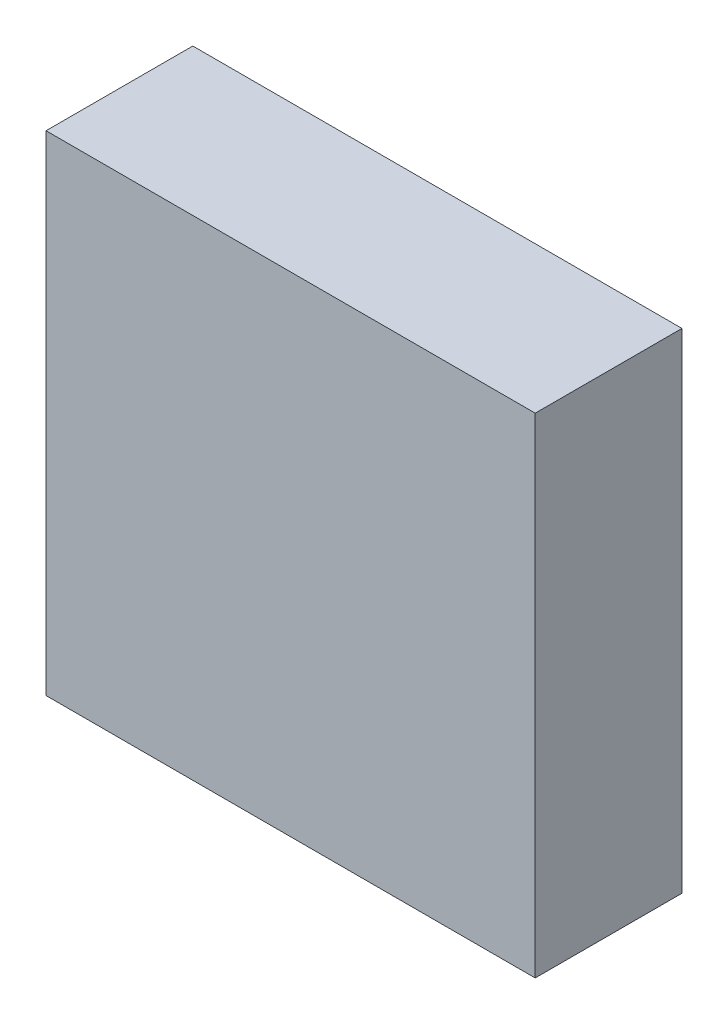
ISO-10303-21;
HEADER;
FILE_DESCRIPTION(('STEP AP214'),'2;1');
FILE_NAME('part.step','',(''),(''),'','','');
FILE_SCHEMA(('AUTOMOTIVE_DESIGN { 1 0 10303 214 1 1 1 1 }'));
ENDSEC;
DATA;
#1=APPLICATION_CONTEXT('core data for automotive mechanical design processes');
#2=APPLICATION_PROTOCOL_DEFINITION('international standard','automotive_design',2000,#1);
#3=PRODUCT_CONTEXT('',#1,'mechanical');
#4=PRODUCT('Part','Part','',(#3));
#5=PRODUCT_RELATED_PRODUCT_CATEGORY('part','',(#4));
#6=PRODUCT_DEFINITION_FORMATION('','',#4);
#7=PRODUCT_DEFINITION_CONTEXT('part definition',#1,'design');
#8=PRODUCT_DEFINITION('design','',#6,#7);
#9=PRODUCT_DEFINITION_SHAPE('','',#8);
#10=(LENGTH_UNIT() NAMED_UNIT(*) SI_UNIT(.MILLI.,.METRE.));
#11=(NAMED_UNIT(*) PLANE_ANGLE_UNIT() SI_UNIT($,.RADIAN.));
#12=(NAMED_UNIT(*) SI_UNIT($,.STERADIAN.) SOLID_ANGLE_UNIT());
#13=UNCERTAINTY_MEASURE_WITH_UNIT(LENGTH_MEASURE(1.E-05),#10,'distance_accuracy_value','');
#14=(GEOMETRIC_REPRESENTATION_CONTEXT(3) GLOBAL_UNCERTAINTY_ASSIGNED_CONTEXT((#13)) GLOBAL_UNIT_ASSIGNED_CONTEXT((#10,
#11,#12)) REPRESENTATION_CONTEXT('',''));
#15=CARTESIAN_POINT('',(0.,0.,0.));
#16=DIRECTION('',(0.,0.,1.));
#17=DIRECTION('',(1.,0.,0.));
#18=AXIS2_PLACEMENT_3D('',#15,#16,#17);
#19=CARTESIAN_POINT('',(0.,0.,12.));
#20=DIRECTION('',(1.,0.,0.));
#21=DIRECTION('',(0.,1.,0.));
#22=AXIS2_PLACEMENT_3D('',#19,#20,#21);
#23=PLANE('',#22);
#24=DIRECTION('',(0.,-1.,0.));
#25=VECTOR('',#24,1.);
#26=CARTESIAN_POINT('',(0.,0.,0.));
#27=LINE('',#26,#25);
#28=CARTESIAN_POINT('',(0.,0.,0.));
#29=VERTEX_POINT('',#28);
#30=CARTESIAN_POINT('',(0.,-40.,0.));
#31=VERTEX_POINT('',#30);
#32=EDGE_CURVE('E102',#29,#31,#27,.T.);
#33=ORIENTED_EDGE('',*,*,#32,.T.);
#34=DIRECTION('',(0.,0.,-1.));
#35=VECTOR('',#34,1.);
#36=CARTESIAN_POINT('',(0.,-40.,12.));
#37=LINE('',#36,#35);
#38=CARTESIAN_POINT('',(0.,-40.,12.));
#39=VERTEX_POINT('',#38);
#40=EDGE_CURVE('E11',#39,#31,#37,.T.);
#41=ORIENTED_EDGE('',*,*,#40,.F.);
#42=DIRECTION('',(0.,-1.,0.));
#43=VECTOR('',#42,1.);
#44=CARTESIAN_POINT('',(0.,0.,12.));
#45=LINE('',#44,#43);
#46=CARTESIAN_POINT('',(0.,0.,12.));
#47=VERTEX_POINT('',#46);
#48=EDGE_CURVE('E90',#47,#39,#45,.T.);
#49=ORIENTED_EDGE('',*,*,#48,.F.);
#50=DIRECTION('',(0.,0.,-1.));
#51=VECTOR('',#50,1.);
#52=CARTESIAN_POINT('',(0.,0.,12.));
#53=LINE('',#52,#51);
#54=EDGE_CURVE('E98',#47,#29,#53,.T.);
#55=ORIENTED_EDGE('',*,*,#54,.T.);
#56=EDGE_LOOP('',(#33,#41,#49,#55));
#57=FACE_BOUND('',#56,.T.);
#58=ADVANCED_FACE('F39',(#57),#23,.F.);
#59=CARTESIAN_POINT('',(0.,-40.,12.));
#60=DIRECTION('',(0.,1.,0.));
#61=DIRECTION('',(0.,0.,1.));
#62=AXIS2_PLACEMENT_3D('',#59,#60,#61);
#63=PLANE('',#62);
#64=DIRECTION('',(1.,0.,0.));
#65=VECTOR('',#64,1.);
#66=CARTESIAN_POINT('',(0.,-40.,0.));
#67=LINE('',#66,#65);
#68=CARTESIAN_POINT('',(40.,-40.,0.));
#69=VERTEX_POINT('',#68);
#70=EDGE_CURVE('E94',#31,#69,#67,.T.);
#71=ORIENTED_EDGE('',*,*,#70,.T.);
#72=DIRECTION('',(0.,0.,-1.));
#73=VECTOR('',#72,1.);
#74=CARTESIAN_POINT('',(40.,-40.,12.));
#75=LINE('',#74,#73);
#76=CARTESIAN_POINT('',(40.,-40.,12.));
#77=VERTEX_POINT('',#76);
#78=EDGE_CURVE('E47',#77,#69,#75,.T.);
#79=ORIENTED_EDGE('',*,*,#78,.F.);
#80=DIRECTION('',(1.,0.,0.));
#81=VECTOR('',#80,1.);
#82=CARTESIAN_POINT('',(0.,-40.,12.));
#83=LINE('',#82,#81);
#84=EDGE_CURVE('E85',#39,#77,#83,.T.);
#85=ORIENTED_EDGE('',*,*,#84,.F.);
#86=ORIENTED_EDGE('',*,*,#40,.T.);
#87=EDGE_LOOP('',(#71,#79,#85,#86));
#88=FACE_BOUND('',#87,.T.);
#89=ADVANCED_FACE('F93',(#88),#63,.F.);
#90=CARTESIAN_POINT('',(40.,0.,12.));
#91=DIRECTION('',(-1.,0.,0.));
#92=DIRECTION('',(0.,-1.,0.));
#93=AXIS2_PLACEMENT_3D('',#90,#91,#92);
#94=PLANE('',#93);
#95=DIRECTION('',(0.,1.,0.));
#96=VECTOR('',#95,1.);
#97=CARTESIAN_POINT('',(40.,0.,0.));
#98=LINE('',#97,#96);
#99=CARTESIAN_POINT('',(40.,0.,0.));
#100=VERTEX_POINT('',#99);
#101=EDGE_CURVE('E72',#69,#100,#98,.T.);
#102=ORIENTED_EDGE('',*,*,#101,.T.);
#103=DIRECTION('',(0.,0.,-1.));
#104=VECTOR('',#103,1.);
#105=CARTESIAN_POINT('',(40.,0.,12.));
#106=LINE('',#105,#104);
#107=CARTESIAN_POINT('',(40.,0.,12.));
#108=VERTEX_POINT('',#107);
#109=EDGE_CURVE('E95',#108,#100,#106,.T.);
#110=ORIENTED_EDGE('',*,*,#109,.F.);
#111=DIRECTION('',(0.,1.,0.));
#112=VECTOR('',#111,1.);
#113=CARTESIAN_POINT('',(40.,0.,12.));
#114=LINE('',#113,#112);
#115=EDGE_CURVE('E88',#77,#108,#114,.T.);
#116=ORIENTED_EDGE('',*,*,#115,.F.);
#117=ORIENTED_EDGE('',*,*,#78,.T.);
#118=EDGE_LOOP('',(#102,#110,#116,#117));
#119=FACE_BOUND('',#118,.T.);
#120=ADVANCED_FACE('F96',(#119),#94,.F.);
#121=CARTESIAN_POINT('',(0.,0.,12.));
#122=DIRECTION('',(0.,-1.,0.));
#123=DIRECTION('',(0.,0.,-1.));
#124=AXIS2_PLACEMENT_3D('',#121,#122,#123);
#125=PLANE('',#124);
#126=DIRECTION('',(-1.,0.,0.));
#127=VECTOR('',#126,1.);
#128=CARTESIAN_POINT('',(0.,0.,0.));
#129=LINE('',#128,#127);
#130=EDGE_CURVE('E78',#100,#29,#129,.T.);
#131=ORIENTED_EDGE('',*,*,#130,.T.);
#132=ORIENTED_EDGE('',*,*,#54,.F.);
#133=DIRECTION('',(-1.,0.,0.));
#134=VECTOR('',#133,1.);
#135=CARTESIAN_POINT('',(0.,0.,12.));
#136=LINE('',#135,#134);
#137=EDGE_CURVE('E55',#108,#47,#136,.T.);
#138=ORIENTED_EDGE('',*,*,#137,.F.);
#139=ORIENTED_EDGE('',*,*,#109,.T.);
#140=EDGE_LOOP('',(#131,#132,#138,#139));
#141=FACE_BOUND('',#140,.T.);
#142=ADVANCED_FACE('F109',(#141),#125,.F.);
#143=CARTESIAN_POINT('',(0.,0.,12.));
#144=DIRECTION('',(0.,0.,1.));
#145=DIRECTION('',(1.,0.,0.));
#146=AXIS2_PLACEMENT_3D('',#143,#144,#145);
#147=PLANE('',#146);
#148=ORIENTED_EDGE('',*,*,#48,.T.);
#149=ORIENTED_EDGE('',*,*,#84,.T.);
#150=ORIENTED_EDGE('',*,*,#115,.T.);
#151=ORIENTED_EDGE('',*,*,#137,.T.);
#152=EDGE_LOOP('',(#148,#149,#150,#151));
#153=FACE_BOUND('',#152,.T.);
#154=ADVANCED_FACE('F86',(#153),#147,.T.);
#155=CARTESIAN_POINT('',(0.,0.,0.));
#156=DIRECTION('',(0.,0.,1.));
#157=DIRECTION('',(1.,0.,0.));
#158=AXIS2_PLACEMENT_3D('',#155,#156,#157);
#159=PLANE('',#158);
#160=ORIENTED_EDGE('',*,*,#32,.F.);
#161=ORIENTED_EDGE('',*,*,#130,.F.);
#162=ORIENTED_EDGE('',*,*,#101,.F.);
#163=ORIENTED_EDGE('',*,*,#70,.F.);
#164=EDGE_LOOP('',(#160,#161,#162,#163));
#165=FACE_BOUND('',#164,.T.);
#166=ADVANCED_FACE('F112',(#165),#159,.F.);
#167=CLOSED_SHELL('',(#58,#89,#120,#142,#154,#166));
#168=MANIFOLD_SOLID_BREP('B2',#167);
#169=ADVANCED_BREP_SHAPE_REPRESENTATION('',(#18,#168),#14);
#170=SHAPE_DEFINITION_REPRESENTATION(#9,#169);
ENDSEC;
END-ISO-10303-21;
